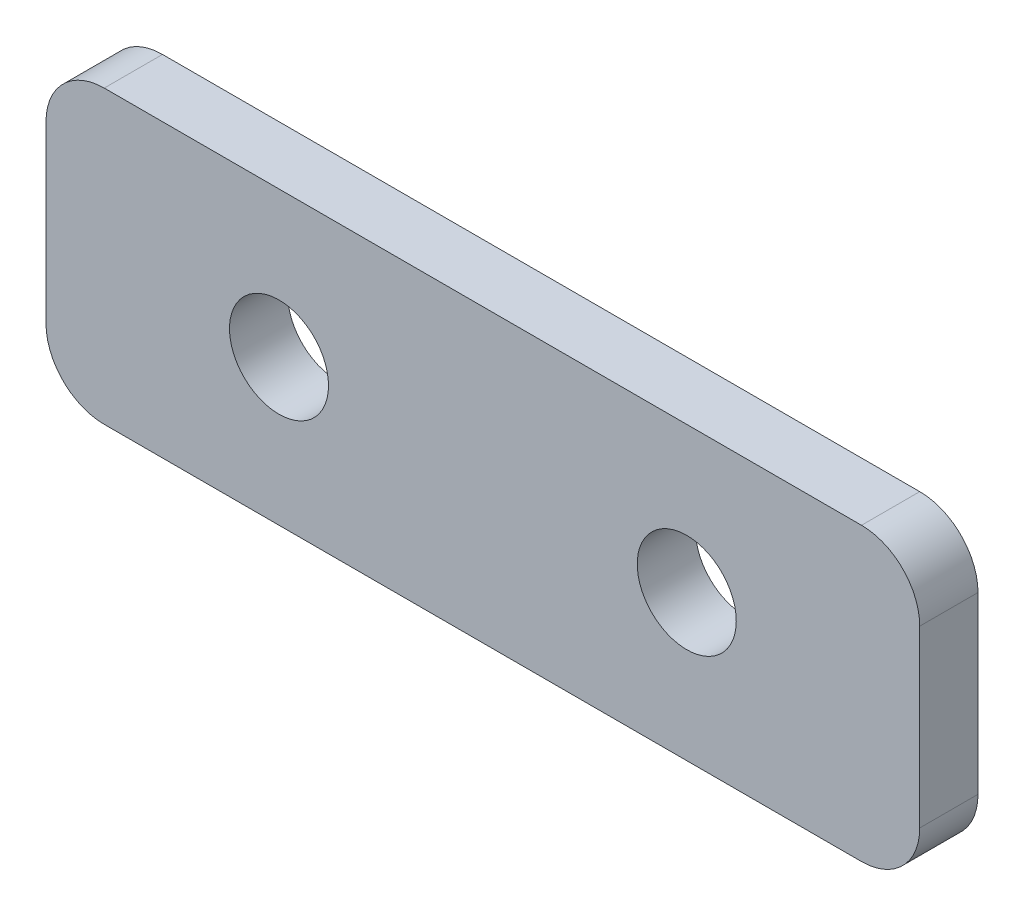
ISO-10303-21;
HEADER;
FILE_DESCRIPTION(('STEP AP214'),'2;1');
FILE_NAME('part.step','',(''),(''),'','','');
FILE_SCHEMA(('AUTOMOTIVE_DESIGN { 1 0 10303 214 1 1 1 1 }'));
ENDSEC;
DATA;
#1=APPLICATION_CONTEXT('core data for automotive mechanical design processes');
#2=APPLICATION_PROTOCOL_DEFINITION('international standard','automotive_design',2000,#1);
#3=PRODUCT_CONTEXT('',#1,'mechanical');
#4=PRODUCT('Part','Part','',(#3));
#5=PRODUCT_RELATED_PRODUCT_CATEGORY('part','',(#4));
#6=PRODUCT_DEFINITION_FORMATION('','',#4);
#7=PRODUCT_DEFINITION_CONTEXT('part definition',#1,'design');
#8=PRODUCT_DEFINITION('design','',#6,#7);
#9=PRODUCT_DEFINITION_SHAPE('','',#8);
#10=(LENGTH_UNIT() NAMED_UNIT(*) SI_UNIT(.MILLI.,.METRE.));
#11=(NAMED_UNIT(*) PLANE_ANGLE_UNIT() SI_UNIT($,.RADIAN.));
#12=(NAMED_UNIT(*) SI_UNIT($,.STERADIAN.) SOLID_ANGLE_UNIT());
#13=UNCERTAINTY_MEASURE_WITH_UNIT(LENGTH_MEASURE(1.E-05),#10,'distance_accuracy_value','');
#14=(GEOMETRIC_REPRESENTATION_CONTEXT(3) GLOBAL_UNCERTAINTY_ASSIGNED_CONTEXT((#13)) GLOBAL_UNIT_ASSIGNED_CONTEXT((#10,
#11,#12)) REPRESENTATION_CONTEXT('',''));
#15=CARTESIAN_POINT('',(0.,0.,0.));
#16=DIRECTION('',(0.,0.,1.));
#17=DIRECTION('',(1.,0.,0.));
#18=AXIS2_PLACEMENT_3D('',#15,#16,#17);
#19=CARTESIAN_POINT('',(15.,-5.,2.));
#20=DIRECTION('',(-1.,0.,0.));
#21=DIRECTION('',(0.,0.,1.));
#22=AXIS2_PLACEMENT_3D('',#19,#20,#21);
#23=PLANE('',#22);
#24=DIRECTION('',(0.,1.,0.));
#25=VECTOR('',#24,1.);
#26=CARTESIAN_POINT('',(15.,-5.,2.));
#27=LINE('',#26,#25);
#28=CARTESIAN_POINT('',(15.,-3.,2.));
#29=VERTEX_POINT('',#28);
#30=CARTESIAN_POINT('',(15.,3.,2.));
#31=VERTEX_POINT('',#30);
#32=EDGE_CURVE('E126',#29,#31,#27,.T.);
#33=ORIENTED_EDGE('',*,*,#32,.F.);
#34=DIRECTION('',(0.,0.,-1.));
#35=VECTOR('',#34,1.);
#36=CARTESIAN_POINT('',(15.,-3.,2.));
#37=LINE('',#36,#35);
#38=CARTESIAN_POINT('',(15.,-3.,0.));
#39=VERTEX_POINT('',#38);
#40=EDGE_CURVE('E152',#29,#39,#37,.T.);
#41=ORIENTED_EDGE('',*,*,#40,.T.);
#42=DIRECTION('',(0.,1.,0.));
#43=VECTOR('',#42,1.);
#44=CARTESIAN_POINT('',(15.,-5.,0.));
#45=LINE('',#44,#43);
#46=CARTESIAN_POINT('',(15.,3.,0.));
#47=VERTEX_POINT('',#46);
#48=EDGE_CURVE('E160',#39,#47,#45,.T.);
#49=ORIENTED_EDGE('',*,*,#48,.T.);
#50=DIRECTION('',(0.,0.,-1.));
#51=VECTOR('',#50,1.);
#52=CARTESIAN_POINT('',(15.,3.,2.));
#53=LINE('',#52,#51);
#54=EDGE_CURVE('E150',#47,#31,#53,.F.);
#55=ORIENTED_EDGE('',*,*,#54,.T.);
#56=EDGE_LOOP('',(#33,#41,#49,#55));
#57=FACE_BOUND('',#56,.T.);
#58=ADVANCED_FACE('F35',(#57),#23,.F.);
#59=CARTESIAN_POINT('',(-15.,5.,2.));
#60=DIRECTION('',(0.,-1.,0.));
#61=DIRECTION('',(0.,0.,-1.));
#62=AXIS2_PLACEMENT_3D('',#59,#60,#61);
#63=PLANE('',#62);
#64=DIRECTION('',(-1.,0.,0.));
#65=VECTOR('',#64,1.);
#66=CARTESIAN_POINT('',(-15.,5.,0.));
#67=LINE('',#66,#65);
#68=CARTESIAN_POINT('',(13.,5.,0.));
#69=VERTEX_POINT('',#68);
#70=CARTESIAN_POINT('',(-13.,5.,0.));
#71=VERTEX_POINT('',#70);
#72=EDGE_CURVE('E131',#69,#71,#67,.T.);
#73=ORIENTED_EDGE('',*,*,#72,.T.);
#74=DIRECTION('',(0.,0.,-1.));
#75=VECTOR('',#74,1.);
#76=CARTESIAN_POINT('',(-13.,5.,2.));
#77=LINE('',#76,#75);
#78=CARTESIAN_POINT('',(-13.,5.,2.));
#79=VERTEX_POINT('',#78);
#80=EDGE_CURVE('E11',#71,#79,#77,.F.);
#81=ORIENTED_EDGE('',*,*,#80,.T.);
#82=DIRECTION('',(-1.,0.,0.));
#83=VECTOR('',#82,1.);
#84=CARTESIAN_POINT('',(-15.,5.,2.));
#85=LINE('',#84,#83);
#86=CARTESIAN_POINT('',(13.,5.,2.));
#87=VERTEX_POINT('',#86);
#88=EDGE_CURVE('E129',#87,#79,#85,.T.);
#89=ORIENTED_EDGE('',*,*,#88,.F.);
#90=DIRECTION('',(0.,0.,-1.));
#91=VECTOR('',#90,1.);
#92=CARTESIAN_POINT('',(13.,5.,2.));
#93=LINE('',#92,#91);
#94=EDGE_CURVE('E43',#87,#69,#93,.T.);
#95=ORIENTED_EDGE('',*,*,#94,.T.);
#96=EDGE_LOOP('',(#73,#81,#89,#95));
#97=FACE_BOUND('',#96,.T.);
#98=ADVANCED_FACE('F157',(#97),#63,.F.);
#99=CARTESIAN_POINT('',(-15.,-5.,2.));
#100=DIRECTION('',(1.,0.,0.));
#101=DIRECTION('',(0.,0.,-1.));
#102=AXIS2_PLACEMENT_3D('',#99,#100,#101);
#103=PLANE('',#102);
#104=DIRECTION('',(0.,-1.,0.));
#105=VECTOR('',#104,1.);
#106=CARTESIAN_POINT('',(-15.,-5.,0.));
#107=LINE('',#106,#105);
#108=CARTESIAN_POINT('',(-15.,3.,0.));
#109=VERTEX_POINT('',#108);
#110=CARTESIAN_POINT('',(-15.,-3.,0.));
#111=VERTEX_POINT('',#110);
#112=EDGE_CURVE('E127',#109,#111,#107,.T.);
#113=ORIENTED_EDGE('',*,*,#112,.T.);
#114=DIRECTION('',(0.,0.,-1.));
#115=VECTOR('',#114,1.);
#116=CARTESIAN_POINT('',(-15.,-3.,2.));
#117=LINE('',#116,#115);
#118=CARTESIAN_POINT('',(-15.,-3.,2.));
#119=VERTEX_POINT('',#118);
#120=EDGE_CURVE('E105',#111,#119,#117,.F.);
#121=ORIENTED_EDGE('',*,*,#120,.T.);
#122=DIRECTION('',(0.,-1.,0.));
#123=VECTOR('',#122,1.);
#124=CARTESIAN_POINT('',(-15.,-5.,2.));
#125=LINE('',#124,#123);
#126=CARTESIAN_POINT('',(-15.,3.,2.));
#127=VERTEX_POINT('',#126);
#128=EDGE_CURVE('E165',#127,#119,#125,.T.);
#129=ORIENTED_EDGE('',*,*,#128,.F.);
#130=DIRECTION('',(0.,0.,-1.));
#131=VECTOR('',#130,1.);
#132=CARTESIAN_POINT('',(-15.,3.,2.));
#133=LINE('',#132,#131);
#134=EDGE_CURVE('E110',#127,#109,#133,.T.);
#135=ORIENTED_EDGE('',*,*,#134,.T.);
#136=EDGE_LOOP('',(#113,#121,#129,#135));
#137=FACE_BOUND('',#136,.T.);
#138=ADVANCED_FACE('F192',(#137),#103,.F.);
#139=CARTESIAN_POINT('',(-15.,-5.,2.));
#140=DIRECTION('',(0.,1.,0.));
#141=DIRECTION('',(0.,0.,1.));
#142=AXIS2_PLACEMENT_3D('',#139,#140,#141);
#143=PLANE('',#142);
#144=DIRECTION('',(1.,0.,0.));
#145=VECTOR('',#144,1.);
#146=CARTESIAN_POINT('',(-15.,-5.,2.));
#147=LINE('',#146,#145);
#148=CARTESIAN_POINT('',(-13.,-5.,2.));
#149=VERTEX_POINT('',#148);
#150=CARTESIAN_POINT('',(13.,-5.,2.));
#151=VERTEX_POINT('',#150);
#152=EDGE_CURVE('E120',#149,#151,#147,.T.);
#153=ORIENTED_EDGE('',*,*,#152,.F.);
#154=DIRECTION('',(0.,0.,-1.));
#155=VECTOR('',#154,1.);
#156=CARTESIAN_POINT('',(-13.,-5.,2.));
#157=LINE('',#156,#155);
#158=CARTESIAN_POINT('',(-13.,-5.,0.));
#159=VERTEX_POINT('',#158);
#160=EDGE_CURVE('E104',#149,#159,#157,.T.);
#161=ORIENTED_EDGE('',*,*,#160,.T.);
#162=DIRECTION('',(1.,0.,0.));
#163=VECTOR('',#162,1.);
#164=CARTESIAN_POINT('',(-15.,-5.,0.));
#165=LINE('',#164,#163);
#166=CARTESIAN_POINT('',(13.,-5.,0.));
#167=VERTEX_POINT('',#166);
#168=EDGE_CURVE('E117',#159,#167,#165,.T.);
#169=ORIENTED_EDGE('',*,*,#168,.T.);
#170=DIRECTION('',(0.,0.,-1.));
#171=VECTOR('',#170,1.);
#172=CARTESIAN_POINT('',(13.,-5.,2.));
#173=LINE('',#172,#171);
#174=EDGE_CURVE('E122',#167,#151,#173,.F.);
#175=ORIENTED_EDGE('',*,*,#174,.T.);
#176=EDGE_LOOP('',(#153,#161,#169,#175));
#177=FACE_BOUND('',#176,.T.);
#178=ADVANCED_FACE('F116',(#177),#143,.F.);
#179=CARTESIAN_POINT('',(0.,0.,2.));
#180=DIRECTION('',(0.,0.,-1.));
#181=DIRECTION('',(-1.,0.,0.));
#182=AXIS2_PLACEMENT_3D('',#179,#180,#181);
#183=PLANE('',#182);
#184=CARTESIAN_POINT('',(-7.,0.,2.));
#185=DIRECTION('',(0.,0.,1.));
#186=DIRECTION('',(1.,0.,0.));
#187=AXIS2_PLACEMENT_3D('',#184,#185,#186);
#188=CIRCLE('',#187,1.7);
#189=CARTESIAN_POINT('',(-5.3,0.,2.));
#190=VERTEX_POINT('',#189);
#191=EDGE_CURVE('E177',#190,#190,#188,.T.);
#192=ORIENTED_EDGE('',*,*,#191,.F.);
#193=EDGE_LOOP('',(#192));
#194=FACE_BOUND('',#193,.T.);
#195=CARTESIAN_POINT('',(7.,0.,2.));
#196=DIRECTION('',(0.,0.,1.));
#197=DIRECTION('',(1.,0.,0.));
#198=AXIS2_PLACEMENT_3D('',#195,#196,#197);
#199=CIRCLE('',#198,1.7);
#200=CARTESIAN_POINT('',(8.7,0.,2.));
#201=VERTEX_POINT('',#200);
#202=EDGE_CURVE('E171',#201,#201,#199,.T.);
#203=ORIENTED_EDGE('',*,*,#202,.F.);
#204=EDGE_LOOP('',(#203));
#205=FACE_BOUND('',#204,.T.);
#206=ORIENTED_EDGE('',*,*,#128,.T.);
#207=CARTESIAN_POINT('',(-13.,-3.,2.));
#208=DIRECTION('',(0.,0.,-1.));
#209=DIRECTION('',(-1.,0.,0.));
#210=AXIS2_PLACEMENT_3D('',#207,#208,#209);
#211=CIRCLE('',#210,2.);
#212=EDGE_CURVE('E148',#119,#149,#211,.F.);
#213=ORIENTED_EDGE('',*,*,#212,.T.);
#214=ORIENTED_EDGE('',*,*,#152,.T.);
#215=CARTESIAN_POINT('',(13.,-3.,2.));
#216=DIRECTION('',(0.,0.,-1.));
#217=DIRECTION('',(-1.,0.,0.));
#218=AXIS2_PLACEMENT_3D('',#215,#216,#217);
#219=CIRCLE('',#218,2.);
#220=EDGE_CURVE('E146',#151,#29,#219,.F.);
#221=ORIENTED_EDGE('',*,*,#220,.T.);
#222=ORIENTED_EDGE('',*,*,#32,.T.);
#223=CARTESIAN_POINT('',(13.,3.,2.));
#224=DIRECTION('',(0.,0.,-1.));
#225=DIRECTION('',(-1.,0.,0.));
#226=AXIS2_PLACEMENT_3D('',#223,#224,#225);
#227=CIRCLE('',#226,2.);
#228=EDGE_CURVE('E55',#31,#87,#227,.F.);
#229=ORIENTED_EDGE('',*,*,#228,.T.);
#230=ORIENTED_EDGE('',*,*,#88,.T.);
#231=CARTESIAN_POINT('',(-13.,3.,2.));
#232=DIRECTION('',(0.,0.,-1.));
#233=DIRECTION('',(-1.,0.,0.));
#234=AXIS2_PLACEMENT_3D('',#231,#232,#233);
#235=CIRCLE('',#234,2.);
#236=EDGE_CURVE('E144',#79,#127,#235,.F.);
#237=ORIENTED_EDGE('',*,*,#236,.T.);
#238=EDGE_LOOP('',(#206,#213,#214,#221,#222,#229,#230,#237));
#239=FACE_BOUND('',#238,.T.);
#240=ADVANCED_FACE('F183',(#194,#205,#239),#183,.F.);
#241=CARTESIAN_POINT('',(0.,0.,0.));
#242=DIRECTION('',(0.,0.,-1.));
#243=DIRECTION('',(-1.,0.,0.));
#244=AXIS2_PLACEMENT_3D('',#241,#242,#243);
#245=PLANE('',#244);
#246=CARTESIAN_POINT('',(-7.,0.,0.));
#247=DIRECTION('',(0.,0.,1.));
#248=DIRECTION('',(1.,0.,0.));
#249=AXIS2_PLACEMENT_3D('',#246,#247,#248);
#250=CIRCLE('',#249,1.7);
#251=CARTESIAN_POINT('',(-5.3,0.,0.));
#252=VERTEX_POINT('',#251);
#253=EDGE_CURVE('E174',#252,#252,#250,.T.);
#254=ORIENTED_EDGE('',*,*,#253,.T.);
#255=EDGE_LOOP('',(#254));
#256=FACE_BOUND('',#255,.T.);
#257=CARTESIAN_POINT('',(7.,0.,0.));
#258=DIRECTION('',(0.,0.,1.));
#259=DIRECTION('',(1.,0.,0.));
#260=AXIS2_PLACEMENT_3D('',#257,#258,#259);
#261=CIRCLE('',#260,1.7);
#262=CARTESIAN_POINT('',(8.7,0.,0.));
#263=VERTEX_POINT('',#262);
#264=EDGE_CURVE('E161',#263,#263,#261,.T.);
#265=ORIENTED_EDGE('',*,*,#264,.T.);
#266=EDGE_LOOP('',(#265));
#267=FACE_BOUND('',#266,.T.);
#268=ORIENTED_EDGE('',*,*,#168,.F.);
#269=CARTESIAN_POINT('',(-13.,-3.,0.));
#270=DIRECTION('',(0.,0.,-1.));
#271=DIRECTION('',(-1.,0.,0.));
#272=AXIS2_PLACEMENT_3D('',#269,#270,#271);
#273=CIRCLE('',#272,2.);
#274=EDGE_CURVE('E100',#159,#111,#273,.T.);
#275=ORIENTED_EDGE('',*,*,#274,.T.);
#276=ORIENTED_EDGE('',*,*,#112,.F.);
#277=CARTESIAN_POINT('',(-13.,3.,0.));
#278=DIRECTION('',(0.,0.,-1.));
#279=DIRECTION('',(-1.,0.,0.));
#280=AXIS2_PLACEMENT_3D('',#277,#278,#279);
#281=CIRCLE('',#280,2.);
#282=EDGE_CURVE('E137',#109,#71,#281,.T.);
#283=ORIENTED_EDGE('',*,*,#282,.T.);
#284=ORIENTED_EDGE('',*,*,#72,.F.);
#285=CARTESIAN_POINT('',(13.,3.,0.));
#286=DIRECTION('',(0.,0.,-1.));
#287=DIRECTION('',(-1.,0.,0.));
#288=AXIS2_PLACEMENT_3D('',#285,#286,#287);
#289=CIRCLE('',#288,2.);
#290=EDGE_CURVE('E121',#69,#47,#289,.T.);
#291=ORIENTED_EDGE('',*,*,#290,.T.);
#292=ORIENTED_EDGE('',*,*,#48,.F.);
#293=CARTESIAN_POINT('',(13.,-3.,0.));
#294=DIRECTION('',(0.,0.,-1.));
#295=DIRECTION('',(-1.,0.,0.));
#296=AXIS2_PLACEMENT_3D('',#293,#294,#295);
#297=CIRCLE('',#296,2.);
#298=EDGE_CURVE('E111',#39,#167,#297,.T.);
#299=ORIENTED_EDGE('',*,*,#298,.T.);
#300=EDGE_LOOP('',(#268,#275,#276,#283,#284,#291,#292,#299));
#301=FACE_BOUND('',#300,.T.);
#302=ADVANCED_FACE('F124',(#256,#267,#301),#245,.T.);
#303=CARTESIAN_POINT('',(7.,0.,2.));
#304=DIRECTION('',(0.,0.,1.));
#305=DIRECTION('',(1.,0.,0.));
#306=AXIS2_PLACEMENT_3D('',#303,#304,#305);
#307=CYLINDRICAL_SURFACE('',#306,1.7);
#308=ORIENTED_EDGE('',*,*,#264,.F.);
#309=EDGE_LOOP('',(#308));
#310=FACE_BOUND('',#309,.T.);
#311=ORIENTED_EDGE('',*,*,#202,.T.);
#312=EDGE_LOOP('',(#311));
#313=FACE_BOUND('',#312,.T.);
#314=ADVANCED_FACE('F217',(#310,#313),#307,.F.);
#315=CARTESIAN_POINT('',(-7.,0.,2.));
#316=DIRECTION('',(0.,0.,1.));
#317=DIRECTION('',(1.,0.,0.));
#318=AXIS2_PLACEMENT_3D('',#315,#316,#317);
#319=CYLINDRICAL_SURFACE('',#318,1.7);
#320=ORIENTED_EDGE('',*,*,#253,.F.);
#321=EDGE_LOOP('',(#320));
#322=FACE_BOUND('',#321,.T.);
#323=ORIENTED_EDGE('',*,*,#191,.T.);
#324=EDGE_LOOP('',(#323));
#325=FACE_BOUND('',#324,.T.);
#326=ADVANCED_FACE('F181',(#322,#325),#319,.F.);
#327=CARTESIAN_POINT('',(-13.,-3.,2.));
#328=DIRECTION('',(0.,0.,-1.));
#329=DIRECTION('',(-1.,0.,0.));
#330=AXIS2_PLACEMENT_3D('',#327,#328,#329);
#331=CYLINDRICAL_SURFACE('',#330,2.);
#332=ORIENTED_EDGE('',*,*,#212,.F.);
#333=ORIENTED_EDGE('',*,*,#120,.F.);
#334=ORIENTED_EDGE('',*,*,#274,.F.);
#335=ORIENTED_EDGE('',*,*,#160,.F.);
#336=EDGE_LOOP('',(#332,#333,#334,#335));
#337=FACE_BOUND('',#336,.T.);
#338=ADVANCED_FACE('F103',(#337),#331,.T.);
#339=CARTESIAN_POINT('',(13.,-3.,2.));
#340=DIRECTION('',(0.,0.,-1.));
#341=DIRECTION('',(-1.,0.,0.));
#342=AXIS2_PLACEMENT_3D('',#339,#340,#341);
#343=CYLINDRICAL_SURFACE('',#342,2.);
#344=ORIENTED_EDGE('',*,*,#220,.F.);
#345=ORIENTED_EDGE('',*,*,#174,.F.);
#346=ORIENTED_EDGE('',*,*,#298,.F.);
#347=ORIENTED_EDGE('',*,*,#40,.F.);
#348=EDGE_LOOP('',(#344,#345,#346,#347));
#349=FACE_BOUND('',#348,.T.);
#350=ADVANCED_FACE('F196',(#349),#343,.T.);
#351=CARTESIAN_POINT('',(-13.,3.,2.));
#352=DIRECTION('',(0.,0.,-1.));
#353=DIRECTION('',(-1.,0.,0.));
#354=AXIS2_PLACEMENT_3D('',#351,#352,#353);
#355=CYLINDRICAL_SURFACE('',#354,2.);
#356=ORIENTED_EDGE('',*,*,#236,.F.);
#357=ORIENTED_EDGE('',*,*,#80,.F.);
#358=ORIENTED_EDGE('',*,*,#282,.F.);
#359=ORIENTED_EDGE('',*,*,#134,.F.);
#360=EDGE_LOOP('',(#356,#357,#358,#359));
#361=FACE_BOUND('',#360,.T.);
#362=ADVANCED_FACE('F194',(#361),#355,.T.);
#363=CARTESIAN_POINT('',(13.,3.,2.));
#364=DIRECTION('',(0.,0.,-1.));
#365=DIRECTION('',(-1.,0.,0.));
#366=AXIS2_PLACEMENT_3D('',#363,#364,#365);
#367=CYLINDRICAL_SURFACE('',#366,2.);
#368=ORIENTED_EDGE('',*,*,#228,.F.);
#369=ORIENTED_EDGE('',*,*,#54,.F.);
#370=ORIENTED_EDGE('',*,*,#290,.F.);
#371=ORIENTED_EDGE('',*,*,#94,.F.);
#372=EDGE_LOOP('',(#368,#369,#370,#371));
#373=FACE_BOUND('',#372,.T.);
#374=ADVANCED_FACE('F37',(#373),#367,.T.);
#375=CLOSED_SHELL('',(#58,#98,#138,#178,#240,#302,#314,#326,#338,#350,#362,#374));
#376=MANIFOLD_SOLID_BREP('B2',#375);
#377=ADVANCED_BREP_SHAPE_REPRESENTATION('',(#18,#376),#14);
#378=SHAPE_DEFINITION_REPRESENTATION(#9,#377);
ENDSEC;
END-ISO-10303-21;
